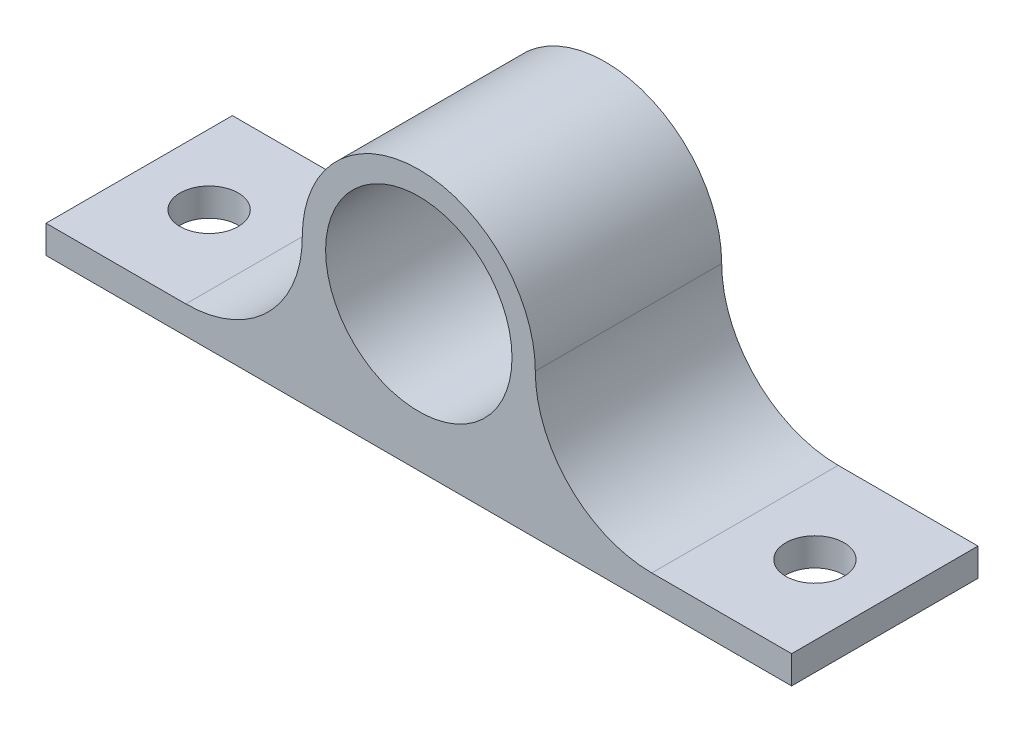
ISO-10303-21;
HEADER;
FILE_DESCRIPTION(('STEP AP214'),'2;1');
FILE_NAME('part.step','',(''),(''),'','','');
FILE_SCHEMA(('AUTOMOTIVE_DESIGN { 1 0 10303 214 1 1 1 1 }'));
ENDSEC;
DATA;
#1=APPLICATION_CONTEXT('core data for automotive mechanical design processes');
#2=APPLICATION_PROTOCOL_DEFINITION('international standard','automotive_design',2000,#1);
#3=PRODUCT_CONTEXT('',#1,'mechanical');
#4=PRODUCT('Part','Part','',(#3));
#5=PRODUCT_RELATED_PRODUCT_CATEGORY('part','',(#4));
#6=PRODUCT_DEFINITION_FORMATION('','',#4);
#7=PRODUCT_DEFINITION_CONTEXT('part definition',#1,'design');
#8=PRODUCT_DEFINITION('design','',#6,#7);
#9=PRODUCT_DEFINITION_SHAPE('','',#8);
#10=(LENGTH_UNIT() NAMED_UNIT(*) SI_UNIT(.MILLI.,.METRE.));
#11=(NAMED_UNIT(*) PLANE_ANGLE_UNIT() SI_UNIT($,.RADIAN.));
#12=(NAMED_UNIT(*) SI_UNIT($,.STERADIAN.) SOLID_ANGLE_UNIT());
#13=UNCERTAINTY_MEASURE_WITH_UNIT(LENGTH_MEASURE(1.E-05),#10,'distance_accuracy_value','');
#14=(GEOMETRIC_REPRESENTATION_CONTEXT(3) GLOBAL_UNCERTAINTY_ASSIGNED_CONTEXT((#13)) GLOBAL_UNIT_ASSIGNED_CONTEXT((#10,
#11,#12)) REPRESENTATION_CONTEXT('',''));
#15=CARTESIAN_POINT('',(0.,0.,0.));
#16=DIRECTION('',(0.,0.,1.));
#17=DIRECTION('',(1.,0.,0.));
#18=AXIS2_PLACEMENT_3D('',#15,#16,#17);
#19=CARTESIAN_POINT('',(0.,-15.875,25.4));
#20=DIRECTION('',(0.,1.,0.));
#21=DIRECTION('',(-1.,0.,0.));
#22=AXIS2_PLACEMENT_3D('',#19,#20,#21);
#23=PLANE('',#22);
#24=CARTESIAN_POINT('',(41.275,-15.875,12.7));
#25=DIRECTION('',(0.,1.,0.));
#26=DIRECTION('',(0.,0.,1.));
#27=AXIS2_PLACEMENT_3D('',#24,#25,#26);
#28=CIRCLE('',#27,3.96874999999999);
#29=CARTESIAN_POINT('',(41.275,-15.875,16.66875));
#30=VERTEX_POINT('',#29);
#31=EDGE_CURVE('E208',#30,#30,#28,.T.);
#32=ORIENTED_EDGE('',*,*,#31,.F.);
#33=EDGE_LOOP('',(#32));
#34=FACE_BOUND('',#33,.T.);
#35=DIRECTION('',(1.,0.,0.));
#36=VECTOR('',#35,1.);
#37=CARTESIAN_POINT('',(0.,-15.875,0.));
#38=LINE('',#37,#36);
#39=CARTESIAN_POINT('',(31.75,-15.875,0.));
#40=VERTEX_POINT('',#39);
#41=CARTESIAN_POINT('',(50.8,-15.875,0.));
#42=VERTEX_POINT('',#41);
#43=EDGE_CURVE('E135',#40,#42,#38,.T.);
#44=ORIENTED_EDGE('',*,*,#43,.F.);
#45=DIRECTION('',(0.,0.,-1.));
#46=VECTOR('',#45,1.);
#47=CARTESIAN_POINT('',(31.75,-15.875,25.4));
#48=LINE('',#47,#46);
#49=CARTESIAN_POINT('',(31.75,-15.875,25.4));
#50=VERTEX_POINT('',#49);
#51=EDGE_CURVE('E11',#50,#40,#48,.T.);
#52=ORIENTED_EDGE('',*,*,#51,.F.);
#53=DIRECTION('',(1.,0.,0.));
#54=VECTOR('',#53,1.);
#55=CARTESIAN_POINT('',(0.,-15.875,25.4));
#56=LINE('',#55,#54);
#57=CARTESIAN_POINT('',(50.8,-15.875,25.4));
#58=VERTEX_POINT('',#57);
#59=EDGE_CURVE('E127',#50,#58,#56,.T.);
#60=ORIENTED_EDGE('',*,*,#59,.T.);
#61=DIRECTION('',(0.,0.,-1.));
#62=VECTOR('',#61,1.);
#63=CARTESIAN_POINT('',(50.8,-15.875,25.4));
#64=LINE('',#63,#62);
#65=EDGE_CURVE('E86',#58,#42,#64,.T.);
#66=ORIENTED_EDGE('',*,*,#65,.T.);
#67=EDGE_LOOP('',(#44,#52,#60,#66));
#68=FACE_BOUND('',#67,.T.);
#69=ADVANCED_FACE('F35',(#34,#68),#23,.T.);
#70=CARTESIAN_POINT('',(31.75,0.,25.4));
#71=DIRECTION('',(0.,0.,-1.));
#72=DIRECTION('',(-1.,0.,0.));
#73=AXIS2_PLACEMENT_3D('',#70,#71,#72);
#74=CYLINDRICAL_SURFACE('',#73,15.875);
#75=CARTESIAN_POINT('',(31.75,0.,0.));
#76=DIRECTION('',(0.,0.,1.));
#77=DIRECTION('',(1.,0.,0.));
#78=AXIS2_PLACEMENT_3D('',#75,#76,#77);
#79=CIRCLE('',#78,15.875);
#80=CARTESIAN_POINT('',(15.875,0.,0.));
#81=VERTEX_POINT('',#80);
#82=EDGE_CURVE('E138',#81,#40,#79,.T.);
#83=ORIENTED_EDGE('',*,*,#82,.F.);
#84=DIRECTION('',(0.,0.,-1.));
#85=VECTOR('',#84,1.);
#86=CARTESIAN_POINT('',(15.875,0.,25.4));
#87=LINE('',#86,#85);
#88=CARTESIAN_POINT('',(15.875,0.,25.4));
#89=VERTEX_POINT('',#88);
#90=EDGE_CURVE('E44',#89,#81,#87,.T.);
#91=ORIENTED_EDGE('',*,*,#90,.F.);
#92=CARTESIAN_POINT('',(31.75,0.,25.4));
#93=DIRECTION('',(0.,0.,1.));
#94=DIRECTION('',(1.,0.,0.));
#95=AXIS2_PLACEMENT_3D('',#92,#93,#94);
#96=CIRCLE('',#95,15.875);
#97=EDGE_CURVE('E177',#89,#50,#96,.T.);
#98=ORIENTED_EDGE('',*,*,#97,.T.);
#99=ORIENTED_EDGE('',*,*,#51,.T.);
#100=EDGE_LOOP('',(#83,#91,#98,#99));
#101=FACE_BOUND('',#100,.T.);
#102=ADVANCED_FACE('F37',(#101),#74,.F.);
#103=CARTESIAN_POINT('',(0.,0.,25.4));
#104=DIRECTION('',(0.,0.,-1.));
#105=DIRECTION('',(-1.,0.,0.));
#106=AXIS2_PLACEMENT_3D('',#103,#104,#105);
#107=CYLINDRICAL_SURFACE('',#106,15.875);
#108=CARTESIAN_POINT('',(0.,0.,0.));
#109=DIRECTION('',(0.,0.,1.));
#110=DIRECTION('',(1.,0.,0.));
#111=AXIS2_PLACEMENT_3D('',#108,#109,#110);
#112=CIRCLE('',#111,15.875);
#113=CARTESIAN_POINT('',(-15.875,0.,0.));
#114=VERTEX_POINT('',#113);
#115=EDGE_CURVE('E143',#81,#114,#112,.T.);
#116=ORIENTED_EDGE('',*,*,#115,.T.);
#117=DIRECTION('',(0.,0.,-1.));
#118=VECTOR('',#117,1.);
#119=CARTESIAN_POINT('',(-15.875,0.,25.4));
#120=LINE('',#119,#118);
#121=CARTESIAN_POINT('',(-15.875,0.,25.4));
#122=VERTEX_POINT('',#121);
#123=EDGE_CURVE('E160',#122,#114,#120,.T.);
#124=ORIENTED_EDGE('',*,*,#123,.F.);
#125=CARTESIAN_POINT('',(0.,0.,25.4));
#126=DIRECTION('',(0.,0.,1.));
#127=DIRECTION('',(1.,0.,0.));
#128=AXIS2_PLACEMENT_3D('',#125,#126,#127);
#129=CIRCLE('',#128,15.875);
#130=EDGE_CURVE('E167',#89,#122,#129,.T.);
#131=ORIENTED_EDGE('',*,*,#130,.F.);
#132=ORIENTED_EDGE('',*,*,#90,.T.);
#133=EDGE_LOOP('',(#116,#124,#131,#132));
#134=FACE_BOUND('',#133,.T.);
#135=ADVANCED_FACE('F165',(#134),#107,.T.);
#136=CARTESIAN_POINT('',(-31.75,0.,25.4));
#137=DIRECTION('',(0.,0.,-1.));
#138=DIRECTION('',(-1.,0.,0.));
#139=AXIS2_PLACEMENT_3D('',#136,#137,#138);
#140=CYLINDRICAL_SURFACE('',#139,15.875);
#141=CARTESIAN_POINT('',(-31.75,0.,0.));
#142=DIRECTION('',(0.,0.,1.));
#143=DIRECTION('',(1.,0.,0.));
#144=AXIS2_PLACEMENT_3D('',#141,#142,#143);
#145=CIRCLE('',#144,15.875);
#146=CARTESIAN_POINT('',(-31.75,-15.875,0.));
#147=VERTEX_POINT('',#146);
#148=EDGE_CURVE('E145',#114,#147,#145,.F.);
#149=ORIENTED_EDGE('',*,*,#148,.T.);
#150=DIRECTION('',(0.,0.,-1.));
#151=VECTOR('',#150,1.);
#152=CARTESIAN_POINT('',(-31.75,-15.875,25.4));
#153=LINE('',#152,#151);
#154=CARTESIAN_POINT('',(-31.75,-15.875,25.4));
#155=VERTEX_POINT('',#154);
#156=EDGE_CURVE('E158',#155,#147,#153,.T.);
#157=ORIENTED_EDGE('',*,*,#156,.F.);
#158=CARTESIAN_POINT('',(-31.75,0.,25.4));
#159=DIRECTION('',(0.,0.,1.));
#160=DIRECTION('',(1.,0.,0.));
#161=AXIS2_PLACEMENT_3D('',#158,#159,#160);
#162=CIRCLE('',#161,15.875);
#163=EDGE_CURVE('E125',#122,#155,#162,.F.);
#164=ORIENTED_EDGE('',*,*,#163,.F.);
#165=ORIENTED_EDGE('',*,*,#123,.T.);
#166=EDGE_LOOP('',(#149,#157,#164,#165));
#167=FACE_BOUND('',#166,.T.);
#168=ADVANCED_FACE('F187',(#167),#140,.F.);
#169=CARTESIAN_POINT('',(-41.275,-15.875,12.7));
#170=DIRECTION('',(0.,1.,0.));
#171=DIRECTION('',(0.,0.,1.));
#172=AXIS2_PLACEMENT_3D('',#169,#170,#171);
#173=CIRCLE('',#172,3.96874999999999);
#174=CARTESIAN_POINT('',(-41.275,-15.875,16.66875));
#175=VERTEX_POINT('',#174);
#176=EDGE_CURVE('E213',#175,#175,#173,.T.);
#177=ORIENTED_EDGE('',*,*,#176,.F.);
#178=EDGE_LOOP('',(#177));
#179=FACE_BOUND('',#178,.T.);
#180=CARTESIAN_POINT('',(-50.8,-15.875,0.));
#181=VERTEX_POINT('',#180);
#182=EDGE_CURVE('E140',#181,#147,#38,.T.);
#183=ORIENTED_EDGE('',*,*,#182,.F.);
#184=DIRECTION('',(0.,0.,-1.));
#185=VECTOR('',#184,1.);
#186=CARTESIAN_POINT('',(-50.8,-15.875,25.4));
#187=LINE('',#186,#185);
#188=CARTESIAN_POINT('',(-50.8,-15.875,25.4));
#189=VERTEX_POINT('',#188);
#190=EDGE_CURVE('E113',#189,#181,#187,.T.);
#191=ORIENTED_EDGE('',*,*,#190,.F.);
#192=EDGE_CURVE('E123',#189,#155,#56,.T.);
#193=ORIENTED_EDGE('',*,*,#192,.T.);
#194=ORIENTED_EDGE('',*,*,#156,.T.);
#195=EDGE_LOOP('',(#183,#191,#193,#194));
#196=FACE_BOUND('',#195,.T.);
#197=ADVANCED_FACE('F190',(#179,#196),#23,.T.);
#198=CARTESIAN_POINT('',(-50.8,0.,25.4));
#199=DIRECTION('',(-1.,0.,0.));
#200=DIRECTION('',(0.,0.,1.));
#201=AXIS2_PLACEMENT_3D('',#198,#199,#200);
#202=PLANE('',#201);
#203=DIRECTION('',(0.,1.,0.));
#204=VECTOR('',#203,1.);
#205=CARTESIAN_POINT('',(-50.8,0.,0.));
#206=LINE('',#205,#204);
#207=CARTESIAN_POINT('',(-50.8,-19.685,0.));
#208=VERTEX_POINT('',#207);
#209=EDGE_CURVE('E112',#208,#181,#206,.T.);
#210=ORIENTED_EDGE('',*,*,#209,.F.);
#211=DIRECTION('',(0.,0.,-1.));
#212=VECTOR('',#211,1.);
#213=CARTESIAN_POINT('',(-50.8,-19.685,25.4));
#214=LINE('',#213,#212);
#215=CARTESIAN_POINT('',(-50.8,-19.685,25.4));
#216=VERTEX_POINT('',#215);
#217=EDGE_CURVE('E106',#216,#208,#214,.T.);
#218=ORIENTED_EDGE('',*,*,#217,.F.);
#219=DIRECTION('',(0.,1.,0.));
#220=VECTOR('',#219,1.);
#221=CARTESIAN_POINT('',(-50.8,0.,25.4));
#222=LINE('',#221,#220);
#223=EDGE_CURVE('E110',#216,#189,#222,.T.);
#224=ORIENTED_EDGE('',*,*,#223,.T.);
#225=ORIENTED_EDGE('',*,*,#190,.T.);
#226=EDGE_LOOP('',(#210,#218,#224,#225));
#227=FACE_BOUND('',#226,.T.);
#228=ADVANCED_FACE('F108',(#227),#202,.T.);
#229=CARTESIAN_POINT('',(0.,-19.685,25.4));
#230=DIRECTION('',(0.,1.,0.));
#231=DIRECTION('',(-1.,0.,0.));
#232=AXIS2_PLACEMENT_3D('',#229,#230,#231);
#233=PLANE('',#232);
#234=CARTESIAN_POINT('',(41.275,-19.685,12.7));
#235=DIRECTION('',(0.,1.,0.));
#236=DIRECTION('',(0.,0.,1.));
#237=AXIS2_PLACEMENT_3D('',#234,#235,#236);
#238=CIRCLE('',#237,3.96875);
#239=CARTESIAN_POINT('',(41.275,-19.685,16.66875));
#240=VERTEX_POINT('',#239);
#241=EDGE_CURVE('E210',#240,#240,#238,.T.);
#242=ORIENTED_EDGE('',*,*,#241,.T.);
#243=EDGE_LOOP('',(#242));
#244=FACE_BOUND('',#243,.T.);
#245=CARTESIAN_POINT('',(-41.275,-19.685,12.7));
#246=DIRECTION('',(0.,1.,0.));
#247=DIRECTION('',(0.,0.,1.));
#248=AXIS2_PLACEMENT_3D('',#245,#246,#247);
#249=CIRCLE('',#248,3.96875);
#250=CARTESIAN_POINT('',(-41.275,-19.685,16.66875));
#251=VERTEX_POINT('',#250);
#252=EDGE_CURVE('E139',#251,#251,#249,.T.);
#253=ORIENTED_EDGE('',*,*,#252,.T.);
#254=EDGE_LOOP('',(#253));
#255=FACE_BOUND('',#254,.T.);
#256=DIRECTION('',(1.,0.,0.));
#257=VECTOR('',#256,1.);
#258=CARTESIAN_POINT('',(0.,-19.685,0.));
#259=LINE('',#258,#257);
#260=CARTESIAN_POINT('',(50.8,-19.685,0.));
#261=VERTEX_POINT('',#260);
#262=EDGE_CURVE('E79',#208,#261,#259,.T.);
#263=ORIENTED_EDGE('',*,*,#262,.T.);
#264=DIRECTION('',(0.,0.,-1.));
#265=VECTOR('',#264,1.);
#266=CARTESIAN_POINT('',(50.8,-19.685,25.4));
#267=LINE('',#266,#265);
#268=CARTESIAN_POINT('',(50.8,-19.685,25.4));
#269=VERTEX_POINT('',#268);
#270=EDGE_CURVE('E114',#269,#261,#267,.T.);
#271=ORIENTED_EDGE('',*,*,#270,.F.);
#272=DIRECTION('',(1.,0.,0.));
#273=VECTOR('',#272,1.);
#274=CARTESIAN_POINT('',(0.,-19.685,25.4));
#275=LINE('',#274,#273);
#276=EDGE_CURVE('E116',#216,#269,#275,.T.);
#277=ORIENTED_EDGE('',*,*,#276,.F.);
#278=ORIENTED_EDGE('',*,*,#217,.T.);
#279=EDGE_LOOP('',(#263,#271,#277,#278));
#280=FACE_BOUND('',#279,.T.);
#281=ADVANCED_FACE('F117',(#244,#255,#280),#233,.F.);
#282=CARTESIAN_POINT('',(50.8,0.,25.4));
#283=DIRECTION('',(-1.,0.,0.));
#284=DIRECTION('',(0.,-1.,0.));
#285=AXIS2_PLACEMENT_3D('',#282,#283,#284);
#286=PLANE('',#285);
#287=DIRECTION('',(0.,1.,0.));
#288=VECTOR('',#287,1.);
#289=CARTESIAN_POINT('',(50.8,0.,0.));
#290=LINE('',#289,#288);
#291=EDGE_CURVE('E150',#261,#42,#290,.T.);
#292=ORIENTED_EDGE('',*,*,#291,.T.);
#293=ORIENTED_EDGE('',*,*,#65,.F.);
#294=DIRECTION('',(0.,1.,0.));
#295=VECTOR('',#294,1.);
#296=CARTESIAN_POINT('',(50.8,0.,25.4));
#297=LINE('',#296,#295);
#298=EDGE_CURVE('E52',#269,#58,#297,.T.);
#299=ORIENTED_EDGE('',*,*,#298,.F.);
#300=ORIENTED_EDGE('',*,*,#270,.T.);
#301=EDGE_LOOP('',(#292,#293,#299,#300));
#302=FACE_BOUND('',#301,.T.);
#303=ADVANCED_FACE('F180',(#302),#286,.F.);
#304=CARTESIAN_POINT('',(0.,0.,25.4));
#305=DIRECTION('',(0.,0.,-1.));
#306=DIRECTION('',(-1.,0.,0.));
#307=AXIS2_PLACEMENT_3D('',#304,#305,#306);
#308=CYLINDRICAL_SURFACE('',#307,12.7);
#309=CARTESIAN_POINT('',(0.,0.,25.4));
#310=DIRECTION('',(0.,0.,1.));
#311=DIRECTION('',(1.,0.,0.));
#312=AXIS2_PLACEMENT_3D('',#309,#310,#311);
#313=CIRCLE('',#312,12.7);
#314=CARTESIAN_POINT('',(12.7,0.,25.4));
#315=VERTEX_POINT('',#314);
#316=EDGE_CURVE('E132',#315,#315,#313,.T.);
#317=ORIENTED_EDGE('',*,*,#316,.T.);
#318=EDGE_LOOP('',(#317));
#319=FACE_BOUND('',#318,.T.);
#320=CARTESIAN_POINT('',(0.,0.,0.));
#321=DIRECTION('',(0.,0.,1.));
#322=DIRECTION('',(1.,0.,0.));
#323=AXIS2_PLACEMENT_3D('',#320,#321,#322);
#324=CIRCLE('',#323,12.7);
#325=CARTESIAN_POINT('',(12.7,0.,0.));
#326=VERTEX_POINT('',#325);
#327=EDGE_CURVE('E152',#326,#326,#324,.T.);
#328=ORIENTED_EDGE('',*,*,#327,.F.);
#329=EDGE_LOOP('',(#328));
#330=FACE_BOUND('',#329,.T.);
#331=ADVANCED_FACE('F234',(#319,#330),#308,.F.);
#332=CARTESIAN_POINT('',(0.,0.,25.4));
#333=DIRECTION('',(0.,0.,1.));
#334=DIRECTION('',(1.,0.,0.));
#335=AXIS2_PLACEMENT_3D('',#332,#333,#334);
#336=PLANE('',#335);
#337=ORIENTED_EDGE('',*,*,#59,.F.);
#338=ORIENTED_EDGE('',*,*,#97,.F.);
#339=ORIENTED_EDGE('',*,*,#130,.T.);
#340=ORIENTED_EDGE('',*,*,#163,.T.);
#341=ORIENTED_EDGE('',*,*,#192,.F.);
#342=ORIENTED_EDGE('',*,*,#223,.F.);
#343=ORIENTED_EDGE('',*,*,#276,.T.);
#344=ORIENTED_EDGE('',*,*,#298,.T.);
#345=EDGE_LOOP('',(#337,#338,#339,#340,#341,#342,#343,#344));
#346=FACE_BOUND('',#345,.T.);
#347=ORIENTED_EDGE('',*,*,#316,.F.);
#348=EDGE_LOOP('',(#347));
#349=FACE_BOUND('',#348,.T.);
#350=ADVANCED_FACE('F120',(#346,#349),#336,.T.);
#351=CARTESIAN_POINT('',(0.,0.,0.));
#352=DIRECTION('',(0.,0.,1.));
#353=DIRECTION('',(1.,0.,0.));
#354=AXIS2_PLACEMENT_3D('',#351,#352,#353);
#355=PLANE('',#354);
#356=ORIENTED_EDGE('',*,*,#43,.T.);
#357=ORIENTED_EDGE('',*,*,#291,.F.);
#358=ORIENTED_EDGE('',*,*,#262,.F.);
#359=ORIENTED_EDGE('',*,*,#209,.T.);
#360=ORIENTED_EDGE('',*,*,#182,.T.);
#361=ORIENTED_EDGE('',*,*,#148,.F.);
#362=ORIENTED_EDGE('',*,*,#115,.F.);
#363=ORIENTED_EDGE('',*,*,#82,.T.);
#364=EDGE_LOOP('',(#356,#357,#358,#359,#360,#361,#362,#363));
#365=FACE_BOUND('',#364,.T.);
#366=ORIENTED_EDGE('',*,*,#327,.T.);
#367=EDGE_LOOP('',(#366));
#368=FACE_BOUND('',#367,.T.);
#369=ADVANCED_FACE('F174',(#365,#368),#355,.F.);
#370=CARTESIAN_POINT('',(-41.275,-15.875,12.7));
#371=DIRECTION('',(0.,1.,0.));
#372=DIRECTION('',(0.,0.,1.));
#373=AXIS2_PLACEMENT_3D('',#370,#371,#372);
#374=CYLINDRICAL_SURFACE('',#373,3.96874999999999);
#375=ORIENTED_EDGE('',*,*,#252,.F.);
#376=EDGE_LOOP('',(#375));
#377=FACE_BOUND('',#376,.T.);
#378=ORIENTED_EDGE('',*,*,#176,.T.);
#379=EDGE_LOOP('',(#378));
#380=FACE_BOUND('',#379,.T.);
#381=ADVANCED_FACE('F221',(#377,#380),#374,.F.);
#382=CARTESIAN_POINT('',(41.275,-15.875,12.7));
#383=DIRECTION('',(0.,1.,0.));
#384=DIRECTION('',(0.,0.,1.));
#385=AXIS2_PLACEMENT_3D('',#382,#383,#384);
#386=CYLINDRICAL_SURFACE('',#385,3.96874999999999);
#387=ORIENTED_EDGE('',*,*,#241,.F.);
#388=EDGE_LOOP('',(#387));
#389=FACE_BOUND('',#388,.T.);
#390=ORIENTED_EDGE('',*,*,#31,.T.);
#391=EDGE_LOOP('',(#390));
#392=FACE_BOUND('',#391,.T.);
#393=ADVANCED_FACE('F223',(#389,#392),#386,.F.);
#394=CLOSED_SHELL('',(#69,#102,#135,#168,#197,#228,#281,#303,#331,#350,#369,#381,#393));
#395=MANIFOLD_SOLID_BREP('B2',#394);
#396=ADVANCED_BREP_SHAPE_REPRESENTATION('',(#18,#395),#14);
#397=SHAPE_DEFINITION_REPRESENTATION(#9,#396);
ENDSEC;
END-ISO-10303-21;
